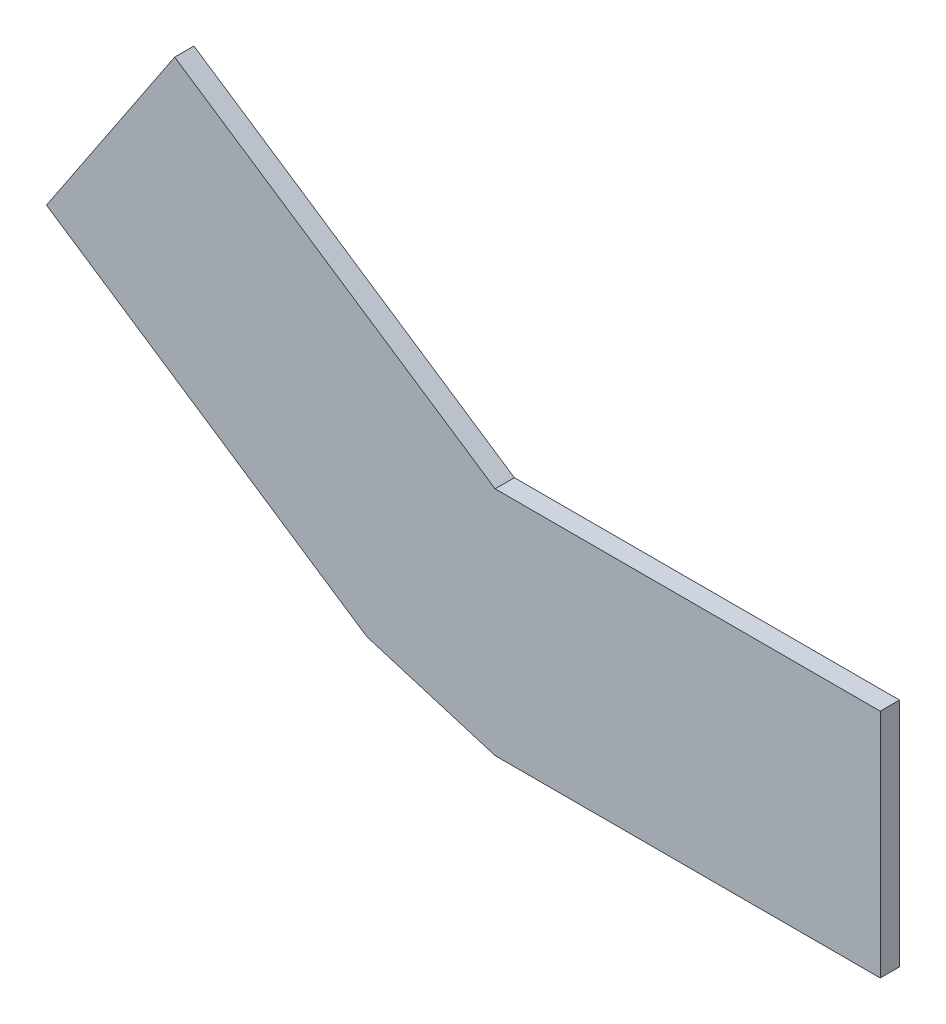
ISO-10303-21;
HEADER;
FILE_DESCRIPTION(('STEP AP214'),'2;1');
FILE_NAME('part.step','',(''),(''),'','','');
FILE_SCHEMA(('AUTOMOTIVE_DESIGN { 1 0 10303 214 1 1 1 1 }'));
ENDSEC;
DATA;
#1=APPLICATION_CONTEXT('core data for automotive mechanical design processes');
#2=APPLICATION_PROTOCOL_DEFINITION('international standard','automotive_design',2000,#1);
#3=PRODUCT_CONTEXT('',#1,'mechanical');
#4=PRODUCT('Part','Part','',(#3));
#5=PRODUCT_RELATED_PRODUCT_CATEGORY('part','',(#4));
#6=PRODUCT_DEFINITION_FORMATION('','',#4);
#7=PRODUCT_DEFINITION_CONTEXT('part definition',#1,'design');
#8=PRODUCT_DEFINITION('design','',#6,#7);
#9=PRODUCT_DEFINITION_SHAPE('','',#8);
#10=(LENGTH_UNIT() NAMED_UNIT(*) SI_UNIT(.MILLI.,.METRE.));
#11=(NAMED_UNIT(*) PLANE_ANGLE_UNIT() SI_UNIT($,.RADIAN.));
#12=(NAMED_UNIT(*) SI_UNIT($,.STERADIAN.) SOLID_ANGLE_UNIT());
#13=UNCERTAINTY_MEASURE_WITH_UNIT(LENGTH_MEASURE(1.E-05),#10,'distance_accuracy_value','');
#14=(GEOMETRIC_REPRESENTATION_CONTEXT(3) GLOBAL_UNCERTAINTY_ASSIGNED_CONTEXT((#13)) GLOBAL_UNIT_ASSIGNED_CONTEXT((#10,
#11,#12)) REPRESENTATION_CONTEXT('',''));
#15=CARTESIAN_POINT('',(0.,0.,0.));
#16=DIRECTION('',(0.,0.,1.));
#17=DIRECTION('',(1.,0.,0.));
#18=AXIS2_PLACEMENT_3D('',#15,#16,#17);
#19=CARTESIAN_POINT('',(-482.733525219217,80.6824134653405,5.));
#20=DIRECTION('',(0.554700196225229,0.832050294337844,0.));
#21=DIRECTION('',(-0.832050294337844,0.554700196225229,0.));
#22=AXIS2_PLACEMENT_3D('',#19,#20,#21);
#23=PLANE('',#22);
#24=DIRECTION('',(0.832050294337844,-0.554700196225229,0.));
#25=VECTOR('',#24,1.);
#26=CARTESIAN_POINT('',(-482.733525219217,80.6824134653405,0.));
#27=LINE('',#26,#25);
#28=CARTESIAN_POINT('',(-482.733525219217,80.6824134653405,0.));
#29=VERTEX_POINT('',#28);
#30=CARTESIAN_POINT('',(-399.528495785433,25.2123938428176,0.));
#31=VERTEX_POINT('',#30);
#32=EDGE_CURVE('E125',#29,#31,#27,.T.);
#33=ORIENTED_EDGE('',*,*,#32,.F.);
#34=DIRECTION('',(0.,0.,-1.));
#35=VECTOR('',#34,1.);
#36=CARTESIAN_POINT('',(-482.733525219217,80.6824134653405,5.));
#37=LINE('',#36,#35);
#38=CARTESIAN_POINT('',(-482.733525219217,80.6824134653405,5.));
#39=VERTEX_POINT('',#38);
#40=EDGE_CURVE('E11',#39,#29,#37,.T.);
#41=ORIENTED_EDGE('',*,*,#40,.F.);
#42=DIRECTION('',(0.832050294337844,-0.554700196225229,0.));
#43=VECTOR('',#42,1.);
#44=CARTESIAN_POINT('',(-482.733525219217,80.6824134653405,5.));
#45=LINE('',#44,#43);
#46=CARTESIAN_POINT('',(-399.528495785433,25.2123938428176,5.));
#47=VERTEX_POINT('',#46);
#48=EDGE_CURVE('E142',#39,#47,#45,.T.);
#49=ORIENTED_EDGE('',*,*,#48,.T.);
#50=DIRECTION('',(0.,0.,-1.));
#51=VECTOR('',#50,1.);
#52=CARTESIAN_POINT('',(-399.528495785433,25.2123938428176,5.));
#53=LINE('',#52,#51);
#54=EDGE_CURVE('E39',#47,#31,#53,.T.);
#55=ORIENTED_EDGE('',*,*,#54,.T.);
#56=EDGE_LOOP('',(#33,#41,#49,#55));
#57=FACE_BOUND('',#56,.T.);
#58=ADVANCED_FACE('F36',(#57),#23,.T.);
#59=CARTESIAN_POINT('',(-516.015536992731,30.7593958050703,5.));
#60=DIRECTION('',(-0.832050294337841,0.554700196225233,0.));
#61=DIRECTION('',(-0.554700196225233,-0.832050294337841,0.));
#62=AXIS2_PLACEMENT_3D('',#59,#60,#61);
#63=PLANE('',#62);
#64=DIRECTION('',(0.554700196225233,0.832050294337841,0.));
#65=VECTOR('',#64,1.);
#66=CARTESIAN_POINT('',(-516.015536992731,30.7593958050703,0.));
#67=LINE('',#66,#65);
#68=CARTESIAN_POINT('',(-516.015536992731,30.7593958050703,0.));
#69=VERTEX_POINT('',#68);
#70=EDGE_CURVE('E140',#69,#29,#67,.T.);
#71=ORIENTED_EDGE('',*,*,#70,.F.);
#72=DIRECTION('',(0.,0.,-1.));
#73=VECTOR('',#72,1.);
#74=CARTESIAN_POINT('',(-516.015536992731,30.7593958050703,5.));
#75=LINE('',#74,#73);
#76=CARTESIAN_POINT('',(-516.015536992731,30.7593958050703,5.));
#77=VERTEX_POINT('',#76);
#78=EDGE_CURVE('E45',#77,#69,#75,.T.);
#79=ORIENTED_EDGE('',*,*,#78,.F.);
#80=DIRECTION('',(0.554700196225233,0.832050294337841,0.));
#81=VECTOR('',#80,1.);
#82=CARTESIAN_POINT('',(-516.015536992731,30.7593958050703,5.));
#83=LINE('',#82,#81);
#84=EDGE_CURVE('E120',#77,#39,#83,.T.);
#85=ORIENTED_EDGE('',*,*,#84,.T.);
#86=ORIENTED_EDGE('',*,*,#40,.T.);
#87=EDGE_LOOP('',(#71,#79,#85,#86));
#88=FACE_BOUND('',#87,.T.);
#89=ADVANCED_FACE('F152',(#88),#63,.T.);
#90=CARTESIAN_POINT('',(-432.810507558946,-24.710623817453,5.));
#91=DIRECTION('',(-0.554700196225232,-0.832050294337842,0.));
#92=DIRECTION('',(0.832050294337842,-0.554700196225232,0.));
#93=AXIS2_PLACEMENT_3D('',#90,#91,#92);
#94=PLANE('',#93);
#95=DIRECTION('',(-0.832050294337842,0.554700196225232,0.));
#96=VECTOR('',#95,1.);
#97=CARTESIAN_POINT('',(-432.810507558946,-24.710623817453,0.));
#98=LINE('',#97,#96);
#99=CARTESIAN_POINT('',(-432.810507558946,-24.710623817453,0.));
#100=VERTEX_POINT('',#99);
#101=EDGE_CURVE('E105',#100,#69,#98,.T.);
#102=ORIENTED_EDGE('',*,*,#101,.F.);
#103=DIRECTION('',(0.,0.,-1.));
#104=VECTOR('',#103,1.);
#105=CARTESIAN_POINT('',(-432.810507558946,-24.710623817453,5.));
#106=LINE('',#105,#104);
#107=CARTESIAN_POINT('',(-432.810507558946,-24.710623817453,5.));
#108=VERTEX_POINT('',#107);
#109=EDGE_CURVE('E99',#108,#100,#106,.T.);
#110=ORIENTED_EDGE('',*,*,#109,.F.);
#111=DIRECTION('',(-0.832050294337842,0.554700196225232,0.));
#112=VECTOR('',#111,1.);
#113=CARTESIAN_POINT('',(-432.810507558946,-24.710623817453,5.));
#114=LINE('',#113,#112);
#115=EDGE_CURVE('E103',#108,#77,#114,.T.);
#116=ORIENTED_EDGE('',*,*,#115,.T.);
#117=ORIENTED_EDGE('',*,*,#78,.T.);
#118=EDGE_LOOP('',(#102,#110,#116,#117));
#119=FACE_BOUND('',#118,.T.);
#120=ADVANCED_FACE('F101',(#119),#94,.T.);
#121=CARTESIAN_POINT('',(-432.810507558946,-24.710623817453,5.));
#122=DIRECTION('',(0.28978414868843,0.957092026489053,0.));
#123=DIRECTION('',(-0.957092026489053,0.28978414868843,0.));
#124=AXIS2_PLACEMENT_3D('',#121,#122,#123);
#125=PLANE('',#124);
#126=DIRECTION('',(0.957092026489053,-0.28978414868843,0.));
#127=VECTOR('',#126,1.);
#128=CARTESIAN_POINT('',(-432.810507558946,-24.710623817453,0.));
#129=LINE('',#128,#127);
#130=CARTESIAN_POINT('',(-399.528495785433,-34.7876061571824,0.));
#131=VERTEX_POINT('',#130);
#132=EDGE_CURVE('E137',#100,#131,#129,.T.);
#133=ORIENTED_EDGE('',*,*,#132,.T.);
#134=DIRECTION('',(0.,0.,-1.));
#135=VECTOR('',#134,1.);
#136=CARTESIAN_POINT('',(-399.528495785433,-34.7876061571824,5.));
#137=LINE('',#136,#135);
#138=CARTESIAN_POINT('',(-399.528495785433,-34.7876061571824,5.));
#139=VERTEX_POINT('',#138);
#140=EDGE_CURVE('E109',#139,#131,#137,.T.);
#141=ORIENTED_EDGE('',*,*,#140,.F.);
#142=DIRECTION('',(0.957092026489053,-0.28978414868843,0.));
#143=VECTOR('',#142,1.);
#144=CARTESIAN_POINT('',(-432.810507558946,-24.710623817453,5.));
#145=LINE('',#144,#143);
#146=EDGE_CURVE('E112',#108,#139,#145,.T.);
#147=ORIENTED_EDGE('',*,*,#146,.F.);
#148=ORIENTED_EDGE('',*,*,#109,.T.);
#149=EDGE_LOOP('',(#133,#141,#147,#148));
#150=FACE_BOUND('',#149,.T.);
#151=ADVANCED_FACE('F113',(#150),#125,.F.);
#152=CARTESIAN_POINT('',(-299.528495785433,-34.7876061571824,5.));
#153=DIRECTION('',(0.,-1.,0.));
#154=DIRECTION('',(1.,0.,0.));
#155=AXIS2_PLACEMENT_3D('',#152,#153,#154);
#156=PLANE('',#155);
#157=DIRECTION('',(-1.,0.,0.));
#158=VECTOR('',#157,1.);
#159=CARTESIAN_POINT('',(-299.528495785433,-34.7876061571824,0.));
#160=LINE('',#159,#158);
#161=CARTESIAN_POINT('',(-299.528495785433,-34.7876061571824,0.));
#162=VERTEX_POINT('',#161);
#163=EDGE_CURVE('E134',#162,#131,#160,.T.);
#164=ORIENTED_EDGE('',*,*,#163,.F.);
#165=DIRECTION('',(0.,0.,-1.));
#166=VECTOR('',#165,1.);
#167=CARTESIAN_POINT('',(-299.528495785433,-34.7876061571824,5.));
#168=LINE('',#167,#166);
#169=CARTESIAN_POINT('',(-299.528495785433,-34.7876061571824,5.));
#170=VERTEX_POINT('',#169);
#171=EDGE_CURVE('E146',#170,#162,#168,.T.);
#172=ORIENTED_EDGE('',*,*,#171,.F.);
#173=DIRECTION('',(-1.,0.,0.));
#174=VECTOR('',#173,1.);
#175=CARTESIAN_POINT('',(-299.528495785433,-34.7876061571824,5.));
#176=LINE('',#175,#174);
#177=EDGE_CURVE('E117',#170,#139,#176,.T.);
#178=ORIENTED_EDGE('',*,*,#177,.T.);
#179=ORIENTED_EDGE('',*,*,#140,.T.);
#180=EDGE_LOOP('',(#164,#172,#178,#179));
#181=FACE_BOUND('',#180,.T.);
#182=ADVANCED_FACE('F165',(#181),#156,.T.);
#183=CARTESIAN_POINT('',(-299.528495785433,25.2123938428176,5.));
#184=DIRECTION('',(1.,0.,0.));
#185=DIRECTION('',(0.,0.,-1.));
#186=AXIS2_PLACEMENT_3D('',#183,#184,#185);
#187=PLANE('',#186);
#188=DIRECTION('',(0.,-1.,0.));
#189=VECTOR('',#188,1.);
#190=CARTESIAN_POINT('',(-299.528495785433,25.2123938428176,0.));
#191=LINE('',#190,#189);
#192=CARTESIAN_POINT('',(-299.528495785433,25.2123938428176,0.));
#193=VERTEX_POINT('',#192);
#194=EDGE_CURVE('E131',#193,#162,#191,.T.);
#195=ORIENTED_EDGE('',*,*,#194,.F.);
#196=DIRECTION('',(0.,0.,-1.));
#197=VECTOR('',#196,1.);
#198=CARTESIAN_POINT('',(-299.528495785433,25.2123938428176,5.));
#199=LINE('',#198,#197);
#200=CARTESIAN_POINT('',(-299.528495785433,25.2123938428176,5.));
#201=VERTEX_POINT('',#200);
#202=EDGE_CURVE('E147',#201,#193,#199,.T.);
#203=ORIENTED_EDGE('',*,*,#202,.F.);
#204=DIRECTION('',(0.,-1.,0.));
#205=VECTOR('',#204,1.);
#206=CARTESIAN_POINT('',(-299.528495785433,25.2123938428176,5.));
#207=LINE('',#206,#205);
#208=EDGE_CURVE('E248',#201,#170,#207,.T.);
#209=ORIENTED_EDGE('',*,*,#208,.T.);
#210=ORIENTED_EDGE('',*,*,#171,.T.);
#211=EDGE_LOOP('',(#195,#203,#209,#210));
#212=FACE_BOUND('',#211,.T.);
#213=ADVANCED_FACE('F168',(#212),#187,.T.);
#214=CARTESIAN_POINT('',(-399.528495785433,25.2123938428176,5.));
#215=DIRECTION('',(0.,1.,0.));
#216=DIRECTION('',(0.,0.,1.));
#217=AXIS2_PLACEMENT_3D('',#214,#215,#216);
#218=PLANE('',#217);
#219=DIRECTION('',(1.,0.,0.));
#220=VECTOR('',#219,1.);
#221=CARTESIAN_POINT('',(-399.528495785433,25.2123938428176,0.));
#222=LINE('',#221,#220);
#223=EDGE_CURVE('E128',#31,#193,#222,.T.);
#224=ORIENTED_EDGE('',*,*,#223,.F.);
#225=ORIENTED_EDGE('',*,*,#54,.F.);
#226=DIRECTION('',(1.,0.,0.));
#227=VECTOR('',#226,1.);
#228=CARTESIAN_POINT('',(-399.528495785433,25.2123938428176,5.));
#229=LINE('',#228,#227);
#230=EDGE_CURVE('E249',#47,#201,#229,.T.);
#231=ORIENTED_EDGE('',*,*,#230,.T.);
#232=ORIENTED_EDGE('',*,*,#202,.T.);
#233=EDGE_LOOP('',(#224,#225,#231,#232));
#234=FACE_BOUND('',#233,.T.);
#235=ADVANCED_FACE('F149',(#234),#218,.T.);
#236=CARTESIAN_POINT('',(0.,0.,5.));
#237=DIRECTION('',(0.,0.,1.));
#238=DIRECTION('',(1.,0.,0.));
#239=AXIS2_PLACEMENT_3D('',#236,#237,#238);
#240=PLANE('',#239);
#241=ORIENTED_EDGE('',*,*,#48,.F.);
#242=ORIENTED_EDGE('',*,*,#84,.F.);
#243=ORIENTED_EDGE('',*,*,#115,.F.);
#244=ORIENTED_EDGE('',*,*,#146,.T.);
#245=ORIENTED_EDGE('',*,*,#177,.F.);
#246=ORIENTED_EDGE('',*,*,#208,.F.);
#247=ORIENTED_EDGE('',*,*,#230,.F.);
#248=EDGE_LOOP('',(#241,#242,#243,#244,#245,#246,#247));
#249=FACE_BOUND('',#248,.T.);
#250=ADVANCED_FACE('F119',(#249),#240,.T.);
#251=CARTESIAN_POINT('',(0.,0.,0.));
#252=DIRECTION('',(0.,0.,1.));
#253=DIRECTION('',(1.,0.,0.));
#254=AXIS2_PLACEMENT_3D('',#251,#252,#253);
#255=PLANE('',#254);
#256=ORIENTED_EDGE('',*,*,#32,.T.);
#257=ORIENTED_EDGE('',*,*,#223,.T.);
#258=ORIENTED_EDGE('',*,*,#194,.T.);
#259=ORIENTED_EDGE('',*,*,#163,.T.);
#260=ORIENTED_EDGE('',*,*,#132,.F.);
#261=ORIENTED_EDGE('',*,*,#101,.T.);
#262=ORIENTED_EDGE('',*,*,#70,.T.);
#263=EDGE_LOOP('',(#256,#257,#258,#259,#260,#261,#262));
#264=FACE_BOUND('',#263,.T.);
#265=ADVANCED_FACE('F151',(#264),#255,.F.);
#266=CLOSED_SHELL('',(#58,#89,#120,#151,#182,#213,#235,#250,#265));
#267=MANIFOLD_SOLID_BREP('B2',#266);
#268=ADVANCED_BREP_SHAPE_REPRESENTATION('',(#18,#267),#14);
#269=SHAPE_DEFINITION_REPRESENTATION(#9,#268);
ENDSEC;
END-ISO-10303-21;
